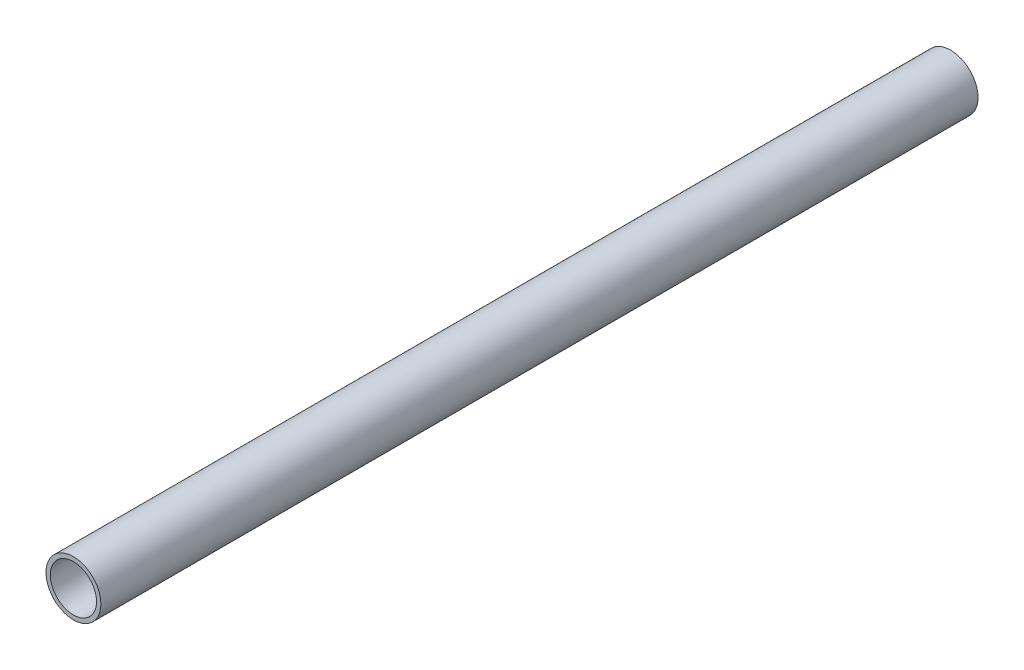
ISO-10303-21;
HEADER;
FILE_DESCRIPTION(('STEP AP214'),'2;1');
FILE_NAME('part.step','',(''),(''),'','','');
FILE_SCHEMA(('AUTOMOTIVE_DESIGN { 1 0 10303 214 1 1 1 1 }'));
ENDSEC;
DATA;
#1=APPLICATION_CONTEXT('core data for automotive mechanical design processes');
#2=APPLICATION_PROTOCOL_DEFINITION('international standard','automotive_design',2000,#1);
#3=PRODUCT_CONTEXT('',#1,'mechanical');
#4=PRODUCT('Part','Part','',(#3));
#5=PRODUCT_RELATED_PRODUCT_CATEGORY('part','',(#4));
#6=PRODUCT_DEFINITION_FORMATION('','',#4);
#7=PRODUCT_DEFINITION_CONTEXT('part definition',#1,'design');
#8=PRODUCT_DEFINITION('design','',#6,#7);
#9=PRODUCT_DEFINITION_SHAPE('','',#8);
#10=(LENGTH_UNIT() NAMED_UNIT(*) SI_UNIT(.MILLI.,.METRE.));
#11=(NAMED_UNIT(*) PLANE_ANGLE_UNIT() SI_UNIT($,.RADIAN.));
#12=(NAMED_UNIT(*) SI_UNIT($,.STERADIAN.) SOLID_ANGLE_UNIT());
#13=UNCERTAINTY_MEASURE_WITH_UNIT(LENGTH_MEASURE(1.E-05),#10,'distance_accuracy_value','');
#14=(GEOMETRIC_REPRESENTATION_CONTEXT(3) GLOBAL_UNCERTAINTY_ASSIGNED_CONTEXT((#13)) GLOBAL_UNIT_ASSIGNED_CONTEXT((#10,
#11,#12)) REPRESENTATION_CONTEXT('',''));
#15=CARTESIAN_POINT('',(0.,0.,0.));
#16=DIRECTION('',(0.,0.,1.));
#17=DIRECTION('',(1.,0.,0.));
#18=AXIS2_PLACEMENT_3D('',#15,#16,#17);
#19=CARTESIAN_POINT('',(0.,0.,152.4));
#20=DIRECTION('',(0.,0.,-1.));
#21=DIRECTION('',(-1.,0.,0.));
#22=AXIS2_PLACEMENT_3D('',#19,#20,#21);
#23=CYLINDRICAL_SURFACE('',#22,4.7625);
#24=CARTESIAN_POINT('',(0.,0.,152.4));
#25=DIRECTION('',(0.,0.,1.));
#26=DIRECTION('',(1.,0.,0.));
#27=AXIS2_PLACEMENT_3D('',#24,#25,#26);
#28=CIRCLE('',#27,4.7625);
#29=CARTESIAN_POINT('',(-4.7625,0.,152.4));
#30=VERTEX_POINT('',#29);
#31=EDGE_CURVE('E10',#30,#30,#28,.T.);
#32=CARTESIAN_POINT('',(0.,0.,0.));
#33=DIRECTION('',(0.,0.,1.));
#34=DIRECTION('',(1.,0.,0.));
#35=AXIS2_PLACEMENT_3D('',#32,#33,#34);
#36=CIRCLE('',#35,4.7625);
#37=CARTESIAN_POINT('',(-4.7625,0.,0.));
#38=VERTEX_POINT('',#37);
#39=EDGE_CURVE('E38',#38,#38,#36,.T.);
#40=CARTESIAN_POINT('',(-4.7625,0.,152.4));
#41=CARTESIAN_POINT('',(-4.7625,0.,150.8125));
#42=CARTESIAN_POINT('',(-4.7625,0.,149.225));
#43=CARTESIAN_POINT('',(-4.7625,0.,146.05));
#44=CARTESIAN_POINT('',(-4.7625,0.,144.4625));
#45=CARTESIAN_POINT('',(-4.7625,0.,141.2875));
#46=CARTESIAN_POINT('',(-4.7625,0.,139.7));
#47=CARTESIAN_POINT('',(-4.7625,0.,136.525));
#48=CARTESIAN_POINT('',(-4.7625,0.,134.9375));
#49=CARTESIAN_POINT('',(-4.7625,0.,131.7625));
#50=CARTESIAN_POINT('',(-4.7625,0.,130.175));
#51=CARTESIAN_POINT('',(-4.7625,0.,127.));
#52=CARTESIAN_POINT('',(-4.7625,0.,125.4125));
#53=CARTESIAN_POINT('',(-4.7625,0.,122.2375));
#54=CARTESIAN_POINT('',(-4.7625,0.,120.65));
#55=CARTESIAN_POINT('',(-4.7625,0.,117.475));
#56=CARTESIAN_POINT('',(-4.7625,0.,115.8875));
#57=CARTESIAN_POINT('',(-4.7625,0.,112.7125));
#58=CARTESIAN_POINT('',(-4.7625,0.,111.125));
#59=CARTESIAN_POINT('',(-4.7625,0.,107.95));
#60=CARTESIAN_POINT('',(-4.7625,0.,106.3625));
#61=CARTESIAN_POINT('',(-4.7625,0.,103.1875));
#62=CARTESIAN_POINT('',(-4.7625,0.,101.6));
#63=CARTESIAN_POINT('',(-4.7625,0.,98.425));
#64=CARTESIAN_POINT('',(-4.7625,0.,96.8375));
#65=CARTESIAN_POINT('',(-4.7625,0.,93.6625));
#66=CARTESIAN_POINT('',(-4.7625,0.,92.075));
#67=CARTESIAN_POINT('',(-4.7625,0.,88.9));
#68=CARTESIAN_POINT('',(-4.7625,0.,87.3125));
#69=CARTESIAN_POINT('',(-4.7625,0.,84.1375));
#70=CARTESIAN_POINT('',(-4.7625,0.,82.55));
#71=CARTESIAN_POINT('',(-4.7625,0.,79.375));
#72=CARTESIAN_POINT('',(-4.7625,0.,77.7875));
#73=CARTESIAN_POINT('',(-4.7625,0.,74.6125));
#74=CARTESIAN_POINT('',(-4.7625,0.,73.025));
#75=CARTESIAN_POINT('',(-4.7625,0.,69.85));
#76=CARTESIAN_POINT('',(-4.7625,0.,68.2625));
#77=CARTESIAN_POINT('',(-4.7625,0.,65.0875));
#78=CARTESIAN_POINT('',(-4.7625,0.,63.5));
#79=CARTESIAN_POINT('',(-4.7625,0.,60.325));
#80=CARTESIAN_POINT('',(-4.7625,0.,58.7375));
#81=CARTESIAN_POINT('',(-4.7625,0.,55.5625));
#82=CARTESIAN_POINT('',(-4.7625,0.,53.975));
#83=CARTESIAN_POINT('',(-4.7625,0.,50.8));
#84=CARTESIAN_POINT('',(-4.7625,0.,49.2125));
#85=CARTESIAN_POINT('',(-4.7625,0.,46.0375));
#86=CARTESIAN_POINT('',(-4.7625,0.,44.45));
#87=CARTESIAN_POINT('',(-4.7625,0.,41.275));
#88=CARTESIAN_POINT('',(-4.7625,0.,39.6875));
#89=CARTESIAN_POINT('',(-4.7625,0.,36.5125));
#90=CARTESIAN_POINT('',(-4.7625,0.,34.925));
#91=CARTESIAN_POINT('',(-4.7625,0.,31.75));
#92=CARTESIAN_POINT('',(-4.7625,0.,30.1625));
#93=CARTESIAN_POINT('',(-4.7625,0.,26.9875));
#94=CARTESIAN_POINT('',(-4.7625,0.,25.4));
#95=CARTESIAN_POINT('',(-4.7625,0.,22.225));
#96=CARTESIAN_POINT('',(-4.7625,0.,20.6375));
#97=CARTESIAN_POINT('',(-4.7625,0.,17.4625));
#98=CARTESIAN_POINT('',(-4.7625,0.,15.875));
#99=CARTESIAN_POINT('',(-4.7625,0.,12.7));
#100=CARTESIAN_POINT('',(-4.7625,0.,11.1125));
#101=CARTESIAN_POINT('',(-4.7625,0.,7.93750000000001));
#102=CARTESIAN_POINT('',(-4.7625,0.,6.35));
#103=CARTESIAN_POINT('',(-4.7625,0.,3.175));
#104=CARTESIAN_POINT('',(-4.7625,0.,1.5875));
#105=CARTESIAN_POINT('',(-4.7625,0.,0.));
#106=B_SPLINE_CURVE_WITH_KNOTS('',3,(#40,#41,#42,#43,#44,#45,#46,#47,#48,#49,#50,#51,#52,#53,
#54,#55,#56,#57,#58,#59,#60,#61,#62,#63,#64,#65,#66,#67,#68,#69,#70,#71,#72,#73,#74,#75,#76,#77,
#78,#79,#80,#81,#82,#83,#84,#85,#86,#87,#88,#89,#90,#91,#92,#93,#94,#95,#96,#97,#98,#99,#100,
#101,#102,#103,#104,#105),.UNSPECIFIED.,.F.,.F.,(4,2,2,2,2,2,2,2,2,2,2,2,2,2,2,2,2,2,2,2,2,2,2,
2,2,2,2,2,2,2,2,2,4),(0.,4.76249999999998,9.52499999999998,14.2875,19.05,23.8125,28.575,33.3375,
38.1,42.8625,47.625,52.3875,57.15,61.9125,66.675,71.4375,76.2,80.9625,85.725,90.4875,95.25,
100.0125,104.775,109.5375,114.3,119.0625,123.825,128.5875,133.35,138.1125,142.875,147.6375,
152.4),.UNSPECIFIED.);
#107=EDGE_CURVE('BSEAM35',#30,#38,#106,.T.);
#108=ORIENTED_EDGE('',*,*,#31,.F.);
#109=ORIENTED_EDGE('',*,*,#39,.T.);
#110=ORIENTED_EDGE('',*,*,#107,.T.);
#111=ORIENTED_EDGE('',*,*,#107,.F.);
#112=EDGE_LOOP('',(#108,#110,#109,#111));
#113=FACE_BOUND('',#112,.T.);
#114=ADVANCED_FACE('F35',(#113),#23,.T.);
#115=CARTESIAN_POINT('',(0.,0.,152.4));
#116=DIRECTION('',(0.,0.,1.));
#117=DIRECTION('',(1.,0.,0.));
#118=AXIS2_PLACEMENT_3D('',#115,#116,#117);
#119=PLANE('',#118);
#120=CARTESIAN_POINT('',(0.,0.,152.4));
#121=DIRECTION('',(0.,0.,1.));
#122=DIRECTION('',(1.,0.,0.));
#123=AXIS2_PLACEMENT_3D('',#120,#121,#122);
#124=CIRCLE('',#123,4.0132);
#125=CARTESIAN_POINT('',(4.0132,0.,152.4));
#126=VERTEX_POINT('',#125);
#127=EDGE_CURVE('E50',#126,#126,#124,.T.);
#128=ORIENTED_EDGE('',*,*,#127,.F.);
#129=EDGE_LOOP('',(#128));
#130=FACE_BOUND('',#129,.T.);
#131=ORIENTED_EDGE('',*,*,#31,.T.);
#132=EDGE_LOOP('',(#131));
#133=FACE_BOUND('',#132,.T.);
#134=ADVANCED_FACE('F65',(#130,#133),#119,.T.);
#135=CARTESIAN_POINT('',(0.,0.,0.));
#136=DIRECTION('',(0.,0.,1.));
#137=DIRECTION('',(1.,0.,0.));
#138=AXIS2_PLACEMENT_3D('',#135,#136,#137);
#139=PLANE('',#138);
#140=ORIENTED_EDGE('',*,*,#39,.F.);
#141=EDGE_LOOP('',(#140));
#142=FACE_BOUND('',#141,.T.);
#143=ADVANCED_FACE('F61',(#142),#139,.F.);
#144=CARTESIAN_POINT('',(0.,0.,127.));
#145=DIRECTION('',(0.,0.,1.));
#146=DIRECTION('',(1.,0.,0.));
#147=AXIS2_PLACEMENT_3D('',#144,#145,#146);
#148=CYLINDRICAL_SURFACE('',#147,4.0132);
#149=CARTESIAN_POINT('',(0.,0.,127.));
#150=DIRECTION('',(0.,0.,1.));
#151=DIRECTION('',(1.,0.,0.));
#152=AXIS2_PLACEMENT_3D('',#149,#150,#151);
#153=CIRCLE('',#152,4.0132);
#154=CARTESIAN_POINT('',(4.0132,0.,127.));
#155=VERTEX_POINT('',#154);
#156=EDGE_CURVE('E48',#155,#155,#153,.T.);
#157=ORIENTED_EDGE('',*,*,#156,.F.);
#158=EDGE_LOOP('',(#157));
#159=FACE_BOUND('',#158,.T.);
#160=ORIENTED_EDGE('',*,*,#127,.T.);
#161=EDGE_LOOP('',(#160));
#162=FACE_BOUND('',#161,.T.);
#163=ADVANCED_FACE('F58',(#159,#162),#148,.F.);
#164=CARTESIAN_POINT('',(0.,0.,127.));
#165=DIRECTION('',(0.,0.,1.));
#166=DIRECTION('',(1.,0.,0.));
#167=AXIS2_PLACEMENT_3D('',#164,#165,#166);
#168=PLANE('',#167);
#169=ORIENTED_EDGE('',*,*,#156,.T.);
#170=EDGE_LOOP('',(#169));
#171=FACE_BOUND('',#170,.T.);
#172=ADVANCED_FACE('F56',(#171),#168,.T.);
#173=CLOSED_SHELL('',(#114,#134,#143,#163,#172));
#174=MANIFOLD_SOLID_BREP('B2',#173);
#175=ADVANCED_BREP_SHAPE_REPRESENTATION('',(#18,#174),#14);
#176=SHAPE_DEFINITION_REPRESENTATION(#9,#175);
ENDSEC;
END-ISO-10303-21;
